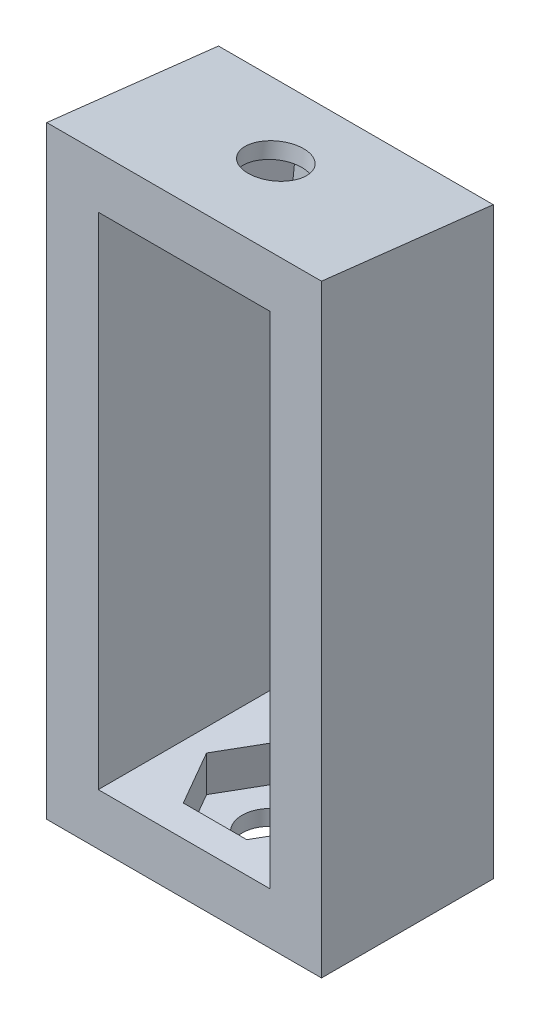
ISO-10303-21;
HEADER;
FILE_DESCRIPTION(('STEP AP214'),'2;1');
FILE_NAME('part.step','',(''),(''),'','','');
FILE_SCHEMA(('AUTOMOTIVE_DESIGN { 1 0 10303 214 1 1 1 1 }'));
ENDSEC;
DATA;
#1=APPLICATION_CONTEXT('core data for automotive mechanical design processes');
#2=APPLICATION_PROTOCOL_DEFINITION('international standard','automotive_design',2000,#1);
#3=PRODUCT_CONTEXT('',#1,'mechanical');
#4=PRODUCT('Part','Part','',(#3));
#5=PRODUCT_RELATED_PRODUCT_CATEGORY('part','',(#4));
#6=PRODUCT_DEFINITION_FORMATION('','',#4);
#7=PRODUCT_DEFINITION_CONTEXT('part definition',#1,'design');
#8=PRODUCT_DEFINITION('design','',#6,#7);
#9=PRODUCT_DEFINITION_SHAPE('','',#8);
#10=(LENGTH_UNIT() NAMED_UNIT(*) SI_UNIT(.MILLI.,.METRE.));
#11=(NAMED_UNIT(*) PLANE_ANGLE_UNIT() SI_UNIT($,.RADIAN.));
#12=(NAMED_UNIT(*) SI_UNIT($,.STERADIAN.) SOLID_ANGLE_UNIT());
#13=UNCERTAINTY_MEASURE_WITH_UNIT(LENGTH_MEASURE(1.E-05),#10,'distance_accuracy_value','');
#14=(GEOMETRIC_REPRESENTATION_CONTEXT(3) GLOBAL_UNCERTAINTY_ASSIGNED_CONTEXT((#13)) GLOBAL_UNIT_ASSIGNED_CONTEXT((#10,
#11,#12)) REPRESENTATION_CONTEXT('',''));
#15=CARTESIAN_POINT('',(0.,0.,0.));
#16=DIRECTION('',(0.,0.,1.));
#17=DIRECTION('',(1.,0.,0.));
#18=AXIS2_PLACEMENT_3D('',#15,#16,#17);
#19=CARTESIAN_POINT('',(3.,0.,10.));
#20=DIRECTION('',(0.,0.,1.));
#21=DIRECTION('',(1.,0.,0.));
#22=AXIS2_PLACEMENT_3D('',#19,#20,#21);
#23=PLANE('',#22);
#24=DIRECTION('',(0.,1.,0.));
#25=VECTOR('',#24,1.);
#26=CARTESIAN_POINT('',(3.,0.,10.));
#27=LINE('',#26,#25);
#28=CARTESIAN_POINT('',(3.,3.,10.));
#29=VERTEX_POINT('',#28);
#30=CARTESIAN_POINT('',(3.,32.1199468849196,10.));
#31=VERTEX_POINT('',#30);
#32=EDGE_CURVE('E402',#29,#31,#27,.T.);
#33=ORIENTED_EDGE('',*,*,#32,.T.);
#34=DIRECTION('',(1.,0.,0.));
#35=VECTOR('',#34,1.);
#36=CARTESIAN_POINT('',(-7.83029679479711,32.1199468849196,10.));
#37=LINE('',#36,#35);
#38=CARTESIAN_POINT('',(13.,32.1199468849196,10.));
#39=VERTEX_POINT('',#38);
#40=EDGE_CURVE('E351',#31,#39,#37,.T.);
#41=ORIENTED_EDGE('',*,*,#40,.T.);
#42=DIRECTION('',(0.,1.,0.));
#43=VECTOR('',#42,1.);
#44=CARTESIAN_POINT('',(13.,0.,10.));
#45=LINE('',#44,#43);
#46=CARTESIAN_POINT('',(13.,3.,10.));
#47=VERTEX_POINT('',#46);
#48=EDGE_CURVE('E377',#47,#39,#45,.T.);
#49=ORIENTED_EDGE('',*,*,#48,.F.);
#50=DIRECTION('',(1.,0.,0.));
#51=VECTOR('',#50,1.);
#52=CARTESIAN_POINT('',(-7.83029679479711,3.,10.));
#53=LINE('',#52,#51);
#54=EDGE_CURVE('E395',#29,#47,#53,.T.);
#55=ORIENTED_EDGE('',*,*,#54,.F.);
#56=EDGE_LOOP('',(#33,#41,#49,#55));
#57=FACE_BOUND('',#56,.T.);
#58=DIRECTION('',(0.,1.,0.));
#59=VECTOR('',#58,1.);
#60=CARTESIAN_POINT('',(0.,0.,10.));
#61=LINE('',#60,#59);
#62=CARTESIAN_POINT('',(0.,0.,10.));
#63=VERTEX_POINT('',#62);
#64=CARTESIAN_POINT('',(0.,35.1393560830164,10.));
#65=VERTEX_POINT('',#64);
#66=EDGE_CURVE('E390',#63,#65,#61,.T.);
#67=ORIENTED_EDGE('',*,*,#66,.F.);
#68=DIRECTION('',(-1.,0.,0.));
#69=VECTOR('',#68,1.);
#70=CARTESIAN_POINT('',(3.,0.,10.));
#71=LINE('',#70,#69);
#72=CARTESIAN_POINT('',(16.,0.,10.));
#73=VERTEX_POINT('',#72);
#74=EDGE_CURVE('E12',#73,#63,#71,.T.);
#75=ORIENTED_EDGE('',*,*,#74,.F.);
#76=DIRECTION('',(0.,1.,0.));
#77=VECTOR('',#76,1.);
#78=CARTESIAN_POINT('',(16.,0.,10.));
#79=LINE('',#78,#77);
#80=CARTESIAN_POINT('',(16.,35.1393560830164,10.));
#81=VERTEX_POINT('',#80);
#82=EDGE_CURVE('E363',#73,#81,#79,.T.);
#83=ORIENTED_EDGE('',*,*,#82,.T.);
#84=DIRECTION('',(-1.,0.,0.));
#85=VECTOR('',#84,1.);
#86=CARTESIAN_POINT('',(3.,35.1393560830164,10.));
#87=LINE('',#86,#85);
#88=EDGE_CURVE('E410',#81,#65,#87,.T.);
#89=ORIENTED_EDGE('',*,*,#88,.T.);
#90=EDGE_LOOP('',(#67,#75,#83,#89));
#91=FACE_BOUND('',#90,.T.);
#92=ADVANCED_FACE('F68',(#57,#91),#23,.T.);
#93=CARTESIAN_POINT('',(3.,0.,0.));
#94=DIRECTION('',(0.,-1.,0.));
#95=DIRECTION('',(0.,0.,-1.));
#96=AXIS2_PLACEMENT_3D('',#93,#94,#95);
#97=PLANE('',#96);
#98=CARTESIAN_POINT('',(8.,0.,5.));
#99=DIRECTION('',(0.,1.,0.));
#100=DIRECTION('',(0.,0.,1.));
#101=AXIS2_PLACEMENT_3D('',#98,#99,#100);
#102=CIRCLE('',#101,1.625);
#103=CARTESIAN_POINT('',(8.,0.,6.625));
#104=VERTEX_POINT('',#103);
#105=EDGE_CURVE('E796',#104,#104,#102,.T.);
#106=ORIENTED_EDGE('',*,*,#105,.T.);
#107=EDGE_LOOP('',(#106));
#108=FACE_BOUND('',#107,.T.);
#109=DIRECTION('',(0.,0.,1.));
#110=VECTOR('',#109,1.);
#111=CARTESIAN_POINT('',(0.,0.,0.));
#112=LINE('',#111,#110);
#113=CARTESIAN_POINT('',(0.,0.,0.));
#114=VERTEX_POINT('',#113);
#115=EDGE_CURVE('E414',#114,#63,#112,.T.);
#116=ORIENTED_EDGE('',*,*,#115,.F.);
#117=DIRECTION('',(-1.,0.,0.));
#118=VECTOR('',#117,1.);
#119=CARTESIAN_POINT('',(3.,0.,0.));
#120=LINE('',#119,#118);
#121=CARTESIAN_POINT('',(16.,0.,0.));
#122=VERTEX_POINT('',#121);
#123=EDGE_CURVE('E77',#122,#114,#120,.T.);
#124=ORIENTED_EDGE('',*,*,#123,.F.);
#125=DIRECTION('',(0.,0.,1.));
#126=VECTOR('',#125,1.);
#127=CARTESIAN_POINT('',(16.,0.,0.));
#128=LINE('',#127,#126);
#129=EDGE_CURVE('E362',#122,#73,#128,.T.);
#130=ORIENTED_EDGE('',*,*,#129,.T.);
#131=ORIENTED_EDGE('',*,*,#74,.T.);
#132=EDGE_LOOP('',(#116,#124,#130,#131));
#133=FACE_BOUND('',#132,.T.);
#134=ADVANCED_FACE('F441',(#108,#133),#97,.T.);
#135=CARTESIAN_POINT('',(3.,0.,0.));
#136=DIRECTION('',(0.,0.,1.));
#137=DIRECTION('',(1.,0.,0.));
#138=AXIS2_PLACEMENT_3D('',#135,#136,#137);
#139=PLANE('',#138);
#140=DIRECTION('',(1.,0.,0.));
#141=VECTOR('',#140,1.);
#142=CARTESIAN_POINT('',(-7.83029679479711,30.9805908019032,0.));
#143=LINE('',#142,#141);
#144=CARTESIAN_POINT('',(3.,30.9805908019032,0.));
#145=VERTEX_POINT('',#144);
#146=CARTESIAN_POINT('',(13.,30.9805908019032,0.));
#147=VERTEX_POINT('',#146);
#148=EDGE_CURVE('E352',#145,#147,#143,.T.);
#149=ORIENTED_EDGE('',*,*,#148,.F.);
#150=DIRECTION('',(0.,1.,0.));
#151=VECTOR('',#150,1.);
#152=CARTESIAN_POINT('',(3.,0.,0.));
#153=LINE('',#152,#151);
#154=CARTESIAN_POINT('',(3.,3.,0.));
#155=VERTEX_POINT('',#154);
#156=EDGE_CURVE('E406',#155,#145,#153,.T.);
#157=ORIENTED_EDGE('',*,*,#156,.F.);
#158=DIRECTION('',(1.,0.,0.));
#159=VECTOR('',#158,1.);
#160=CARTESIAN_POINT('',(-7.83029679479711,3.,0.));
#161=LINE('',#160,#159);
#162=CARTESIAN_POINT('',(13.,3.,0.));
#163=VERTEX_POINT('',#162);
#164=EDGE_CURVE('E391',#155,#163,#161,.T.);
#165=ORIENTED_EDGE('',*,*,#164,.T.);
#166=DIRECTION('',(0.,1.,0.));
#167=VECTOR('',#166,1.);
#168=CARTESIAN_POINT('',(13.,0.,0.));
#169=LINE('',#168,#167);
#170=EDGE_CURVE('E368',#163,#147,#169,.T.);
#171=ORIENTED_EDGE('',*,*,#170,.T.);
#172=EDGE_LOOP('',(#149,#157,#165,#171));
#173=FACE_BOUND('',#172,.T.);
#174=DIRECTION('',(0.,1.,0.));
#175=VECTOR('',#174,1.);
#176=CARTESIAN_POINT('',(0.,0.,0.));
#177=LINE('',#176,#175);
#178=CARTESIAN_POINT('',(0.,34.,0.));
#179=VERTEX_POINT('',#178);
#180=EDGE_CURVE('E418',#114,#179,#177,.T.);
#181=ORIENTED_EDGE('',*,*,#180,.T.);
#182=DIRECTION('',(-1.,0.,0.));
#183=VECTOR('',#182,1.);
#184=CARTESIAN_POINT('',(3.,34.,0.));
#185=LINE('',#184,#183);
#186=CARTESIAN_POINT('',(16.,34.,0.));
#187=VERTEX_POINT('',#186);
#188=EDGE_CURVE('E427',#187,#179,#185,.T.);
#189=ORIENTED_EDGE('',*,*,#188,.F.);
#190=DIRECTION('',(0.,1.,0.));
#191=VECTOR('',#190,1.);
#192=CARTESIAN_POINT('',(16.,0.,0.));
#193=LINE('',#192,#191);
#194=EDGE_CURVE('E367',#122,#187,#193,.T.);
#195=ORIENTED_EDGE('',*,*,#194,.F.);
#196=ORIENTED_EDGE('',*,*,#123,.T.);
#197=EDGE_LOOP('',(#181,#189,#195,#196));
#198=FACE_BOUND('',#197,.T.);
#199=ADVANCED_FACE('F434',(#173,#198),#139,.F.);
#200=CARTESIAN_POINT('',(3.,33.5642911013491,-3.82416792384546));
#201=DIRECTION('',(0.,0.993571855676588,-0.113203213767899));
#202=DIRECTION('',(0.,0.113203213767899,0.993571855676588));
#203=AXIS2_PLACEMENT_3D('',#200,#201,#202);
#204=PLANE('',#203);
#205=CARTESIAN_POINT('',(8.,34.5309844104412,4.66039035869631));
#206=DIRECTION('',(0.,0.993571855676588,-0.113203213767899));
#207=DIRECTION('',(0.,0.113203213767899,0.993571855676588));
#208=AXIS2_PLACEMENT_3D('',#205,#206,#207);
#209=CIRCLE('',#208,1.625);
#210=CARTESIAN_POINT('',(8.,34.714939632814,6.27494462417076));
#211=VERTEX_POINT('',#210);
#212=EDGE_CURVE('E280',#211,#211,#209,.T.);
#213=ORIENTED_EDGE('',*,*,#212,.F.);
#214=EDGE_LOOP('',(#213));
#215=FACE_BOUND('',#214,.T.);
#216=DIRECTION('',(0.,-0.113203213767899,-0.993571855676588));
#217=VECTOR('',#216,1.);
#218=CARTESIAN_POINT('',(0.,33.5642911013491,-3.82416792384546));
#219=LINE('',#218,#217);
#220=EDGE_CURVE('E407',#65,#179,#219,.T.);
#221=ORIENTED_EDGE('',*,*,#220,.F.);
#222=ORIENTED_EDGE('',*,*,#88,.F.);
#223=DIRECTION('',(0.,-0.113203213767899,-0.993571855676588));
#224=VECTOR('',#223,1.);
#225=CARTESIAN_POINT('',(16.,33.5642911013491,-3.82416792384546));
#226=LINE('',#225,#224);
#227=EDGE_CURVE('E372',#81,#187,#226,.T.);
#228=ORIENTED_EDGE('',*,*,#227,.T.);
#229=ORIENTED_EDGE('',*,*,#188,.T.);
#230=EDGE_LOOP('',(#221,#222,#228,#229));
#231=FACE_BOUND('',#230,.T.);
#232=ADVANCED_FACE('F446',(#215,#231),#204,.T.);
#233=CARTESIAN_POINT('',(3.,0.,0.));
#234=DIRECTION('',(1.,0.,0.));
#235=DIRECTION('',(0.,0.,-1.));
#236=AXIS2_PLACEMENT_3D('',#233,#234,#235);
#237=PLANE('',#236);
#238=DIRECTION('',(0.,0.1132032137679,0.993571855676588));
#239=VECTOR('',#238,1.);
#240=CARTESIAN_POINT('',(3.,30.5835755343193,-3.48455828254177));
#241=LINE('',#240,#239);
#242=EDGE_CURVE('E356',#145,#31,#241,.T.);
#243=ORIENTED_EDGE('',*,*,#242,.T.);
#244=ORIENTED_EDGE('',*,*,#32,.F.);
#245=DIRECTION('',(0.,0.,1.));
#246=VECTOR('',#245,1.);
#247=CARTESIAN_POINT('',(3.,3.,0.));
#248=LINE('',#247,#246);
#249=EDGE_CURVE('E386',#155,#29,#248,.T.);
#250=ORIENTED_EDGE('',*,*,#249,.F.);
#251=ORIENTED_EDGE('',*,*,#156,.T.);
#252=EDGE_LOOP('',(#243,#244,#250,#251));
#253=FACE_BOUND('',#252,.T.);
#254=ADVANCED_FACE('F482',(#253),#237,.T.);
#255=CARTESIAN_POINT('',(0.,0.,0.));
#256=DIRECTION('',(1.,0.,0.));
#257=DIRECTION('',(0.,0.,-1.));
#258=AXIS2_PLACEMENT_3D('',#255,#256,#257);
#259=PLANE('',#258);
#260=ORIENTED_EDGE('',*,*,#66,.T.);
#261=ORIENTED_EDGE('',*,*,#220,.T.);
#262=ORIENTED_EDGE('',*,*,#180,.F.);
#263=ORIENTED_EDGE('',*,*,#115,.T.);
#264=EDGE_LOOP('',(#260,#261,#262,#263));
#265=FACE_BOUND('',#264,.T.);
#266=ADVANCED_FACE('F439',(#265),#259,.F.);
#267=CARTESIAN_POINT('',(-7.83029679479711,3.,0.));
#268=DIRECTION('',(0.,-1.,0.));
#269=DIRECTION('',(0.,0.,-1.));
#270=AXIS2_PLACEMENT_3D('',#267,#268,#269);
#271=PLANE('',#270);
#272=DIRECTION('',(-0.5,0.,0.866025403784439));
#273=VECTOR('',#272,1.);
#274=CARTESIAN_POINT('',(6.1524791385932,3.,1.8));
#275=LINE('',#274,#273);
#276=CARTESIAN_POINT('',(6.1524791385932,3.,1.8));
#277=VERTEX_POINT('',#276);
#278=CARTESIAN_POINT('',(4.3049582771864,3.,5.));
#279=VERTEX_POINT('',#278);
#280=EDGE_CURVE('E252',#277,#279,#275,.T.);
#281=ORIENTED_EDGE('',*,*,#280,.F.);
#282=DIRECTION('',(-1.,0.,0.));
#283=VECTOR('',#282,1.);
#284=CARTESIAN_POINT('',(9.8475208614068,3.,1.8));
#285=LINE('',#284,#283);
#286=CARTESIAN_POINT('',(9.8475208614068,3.,1.8));
#287=VERTEX_POINT('',#286);
#288=EDGE_CURVE('E84',#287,#277,#285,.T.);
#289=ORIENTED_EDGE('',*,*,#288,.F.);
#290=DIRECTION('',(-0.500000000000001,0.,-0.866025403784438));
#291=VECTOR('',#290,1.);
#292=CARTESIAN_POINT('',(11.6950417228136,3.,5.));
#293=LINE('',#292,#291);
#294=CARTESIAN_POINT('',(11.6950417228136,3.,5.));
#295=VERTEX_POINT('',#294);
#296=EDGE_CURVE('E229',#295,#287,#293,.T.);
#297=ORIENTED_EDGE('',*,*,#296,.F.);
#298=DIRECTION('',(0.5,0.,-0.866025403784439));
#299=VECTOR('',#298,1.);
#300=CARTESIAN_POINT('',(9.8475208614068,3.,8.2));
#301=LINE('',#300,#299);
#302=CARTESIAN_POINT('',(9.8475208614068,3.,8.2));
#303=VERTEX_POINT('',#302);
#304=EDGE_CURVE('E233',#303,#295,#301,.T.);
#305=ORIENTED_EDGE('',*,*,#304,.F.);
#306=DIRECTION('',(1.,0.,0.));
#307=VECTOR('',#306,1.);
#308=CARTESIAN_POINT('',(6.1524791385932,3.,8.2));
#309=LINE('',#308,#307);
#310=CARTESIAN_POINT('',(6.1524791385932,3.,8.2));
#311=VERTEX_POINT('',#310);
#312=EDGE_CURVE('E259',#311,#303,#309,.T.);
#313=ORIENTED_EDGE('',*,*,#312,.F.);
#314=DIRECTION('',(0.5,0.,0.866025403784438));
#315=VECTOR('',#314,1.);
#316=CARTESIAN_POINT('',(4.3049582771864,3.,5.));
#317=LINE('',#316,#315);
#318=EDGE_CURVE('E255',#279,#311,#317,.T.);
#319=ORIENTED_EDGE('',*,*,#318,.F.);
#320=EDGE_LOOP('',(#281,#289,#297,#305,#313,#319));
#321=FACE_BOUND('',#320,.T.);
#322=ORIENTED_EDGE('',*,*,#164,.F.);
#323=ORIENTED_EDGE('',*,*,#249,.T.);
#324=ORIENTED_EDGE('',*,*,#54,.T.);
#325=DIRECTION('',(0.,0.,-1.));
#326=VECTOR('',#325,1.);
#327=CARTESIAN_POINT('',(13.,3.,0.));
#328=LINE('',#327,#326);
#329=EDGE_CURVE('E376',#47,#163,#328,.T.);
#330=ORIENTED_EDGE('',*,*,#329,.T.);
#331=EDGE_LOOP('',(#322,#323,#324,#330));
#332=FACE_BOUND('',#331,.T.);
#333=ADVANCED_FACE('F461',(#321,#332),#271,.F.);
#334=CARTESIAN_POINT('',(13.,0.,0.));
#335=DIRECTION('',(1.,0.,0.));
#336=DIRECTION('',(0.,0.,-1.));
#337=AXIS2_PLACEMENT_3D('',#334,#335,#336);
#338=PLANE('',#337);
#339=ORIENTED_EDGE('',*,*,#48,.T.);
#340=DIRECTION('',(0.,-0.1132032137679,-0.993571855676588));
#341=VECTOR('',#340,1.);
#342=CARTESIAN_POINT('',(13.,30.5835755343193,-3.48455828254177));
#343=LINE('',#342,#341);
#344=EDGE_CURVE('E334',#39,#147,#343,.T.);
#345=ORIENTED_EDGE('',*,*,#344,.T.);
#346=ORIENTED_EDGE('',*,*,#170,.F.);
#347=ORIENTED_EDGE('',*,*,#329,.F.);
#348=EDGE_LOOP('',(#339,#345,#346,#347));
#349=FACE_BOUND('',#348,.T.);
#350=ADVANCED_FACE('F452',(#349),#338,.F.);
#351=CARTESIAN_POINT('',(16.,0.,0.));
#352=DIRECTION('',(1.,0.,0.));
#353=DIRECTION('',(0.,0.,-1.));
#354=AXIS2_PLACEMENT_3D('',#351,#352,#353);
#355=PLANE('',#354);
#356=ORIENTED_EDGE('',*,*,#82,.F.);
#357=ORIENTED_EDGE('',*,*,#129,.F.);
#358=ORIENTED_EDGE('',*,*,#194,.T.);
#359=ORIENTED_EDGE('',*,*,#227,.F.);
#360=EDGE_LOOP('',(#356,#357,#358,#359));
#361=FACE_BOUND('',#360,.T.);
#362=ADVANCED_FACE('F449',(#361),#355,.T.);
#363=CARTESIAN_POINT('',(-7.83029679479711,30.5835755343193,-3.48455828254177));
#364=DIRECTION('',(0.,-0.993571855676588,0.1132032137679));
#365=DIRECTION('',(0.,-0.1132032137679,-0.993571855676588));
#366=AXIS2_PLACEMENT_3D('',#363,#364,#365);
#367=PLANE('',#366);
#368=DIRECTION('',(0.5,-0.0980368589130412,-0.860458467501171));
#369=VECTOR('',#368,1.);
#370=CARTESIAN_POINT('',(6.92640950427774,31.0362711552159,0.488700189015822));
#371=LINE('',#370,#369);
#372=CARTESIAN_POINT('',(4.30495827718639,31.5502688434114,5.));
#373=VERTEX_POINT('',#372);
#374=CARTESIAN_POINT('',(6.15247913859319,31.1880185593541,1.82057006183492));
#375=VERTEX_POINT('',#374);
#376=EDGE_CURVE('E92',#373,#375,#371,.T.);
#377=ORIENTED_EDGE('',*,*,#376,.F.);
#378=DIRECTION('',(-0.5,-0.0980368589130414,-0.860458467501172));
#379=VECTOR('',#378,1.);
#380=CARTESIAN_POINT('',(-0.468972088498158,30.6142265679688,-3.21553761282847));
#381=LINE('',#380,#379);
#382=CARTESIAN_POINT('',(6.15247913859319,31.9125191274687,8.17942993816509));
#383=VERTEX_POINT('',#382);
#384=EDGE_CURVE('E289',#383,#373,#381,.T.);
#385=ORIENTED_EDGE('',*,*,#384,.F.);
#386=DIRECTION('',(-1.,0.,0.));
#387=VECTOR('',#386,1.);
#388=CARTESIAN_POINT('',(0.,31.9125191274687,8.17942993816509));
#389=LINE('',#388,#387);
#390=CARTESIAN_POINT('',(9.8475208614068,31.9125191274687,8.17942993816508));
#391=VERTEX_POINT('',#390);
#392=EDGE_CURVE('E324',#391,#383,#389,.T.);
#393=ORIENTED_EDGE('',*,*,#392,.F.);
#394=DIRECTION('',(-0.5,0.0980368589130412,0.860458467501171));
#395=VECTOR('',#394,1.);
#396=CARTESIAN_POINT('',(12.4689720884982,31.3985214392731,3.6681301271809));
#397=LINE('',#396,#395);
#398=CARTESIAN_POINT('',(11.6950417228136,31.5502688434114,5.));
#399=VERTEX_POINT('',#398);
#400=EDGE_CURVE('E320',#399,#391,#397,.T.);
#401=ORIENTED_EDGE('',*,*,#400,.F.);
#402=DIRECTION('',(0.5,0.0980368589130413,0.860458467501171));
#403=VECTOR('',#402,1.);
#404=CARTESIAN_POINT('',(5.07359049572225,30.2519762839115,-6.39496755099355));
#405=LINE('',#404,#403);
#406=CARTESIAN_POINT('',(9.8475208614068,31.1880185593541,1.82057006183492));
#407=VERTEX_POINT('',#406);
#408=EDGE_CURVE('E316',#407,#399,#405,.T.);
#409=ORIENTED_EDGE('',*,*,#408,.F.);
#410=DIRECTION('',(1.,0.,0.));
#411=VECTOR('',#410,1.);
#412=CARTESIAN_POINT('',(0.,31.1880185593541,1.82057006183492));
#413=LINE('',#412,#411);
#414=EDGE_CURVE('E312',#375,#407,#413,.T.);
#415=ORIENTED_EDGE('',*,*,#414,.F.);
#416=EDGE_LOOP('',(#377,#385,#393,#401,#409,#415));
#417=FACE_BOUND('',#416,.T.);
#418=ORIENTED_EDGE('',*,*,#242,.F.);
#419=ORIENTED_EDGE('',*,*,#148,.T.);
#420=ORIENTED_EDGE('',*,*,#344,.F.);
#421=ORIENTED_EDGE('',*,*,#40,.F.);
#422=EDGE_LOOP('',(#418,#419,#420,#421));
#423=FACE_BOUND('',#422,.T.);
#424=ADVANCED_FACE('F451',(#417,#423),#367,.T.);
#425=CARTESIAN_POINT('',(6.92640950427774,33.1227720521367,0.250973440103233));
#426=DIRECTION('',(-0.866025403784439,-0.0566016068839497,-0.496785927838294));
#427=DIRECTION('',(-0.497583632026221,0.,0.867416006965282));
#428=AXIS2_PLACEMENT_3D('',#425,#426,#427);
#429=PLANE('',#428);
#430=ORIENTED_EDGE('',*,*,#376,.T.);
#431=DIRECTION('',(0.,-0.993571855676588,0.113203213767899));
#432=VECTOR('',#431,1.);
#433=CARTESIAN_POINT('',(6.15247913859319,33.274519456275,1.58284331292233));
#434=LINE('',#433,#432);
#435=CARTESIAN_POINT('',(6.15247913859319,33.274519456275,1.58284331292233));
#436=VERTEX_POINT('',#435);
#437=EDGE_CURVE('E309',#436,#375,#434,.T.);
#438=ORIENTED_EDGE('',*,*,#437,.F.);
#439=DIRECTION('',(0.5,-0.0980368589130412,-0.860458467501171));
#440=VECTOR('',#439,1.);
#441=CARTESIAN_POINT('',(6.92640950427774,33.1227720521367,0.250973440103233));
#442=LINE('',#441,#440);
#443=CARTESIAN_POINT('',(4.30495827718639,33.6367697403322,4.76227325108741));
#444=VERTEX_POINT('',#443);
#445=EDGE_CURVE('E284',#444,#436,#442,.T.);
#446=ORIENTED_EDGE('',*,*,#445,.F.);
#447=DIRECTION('',(0.,-0.993571855676588,0.113203213767899));
#448=VECTOR('',#447,1.);
#449=CARTESIAN_POINT('',(4.30495827718639,33.6367697403322,4.76227325108741));
#450=LINE('',#449,#448);
#451=EDGE_CURVE('E331',#444,#373,#450,.T.);
#452=ORIENTED_EDGE('',*,*,#451,.T.);
#453=EDGE_LOOP('',(#430,#438,#446,#452));
#454=FACE_BOUND('',#453,.T.);
#455=ADVANCED_FACE('F458',(#454),#429,.F.);
#456=CARTESIAN_POINT('',(-0.468972088498158,32.7007274648896,-3.45326436174106));
#457=DIRECTION('',(-0.866025403784439,0.0566016068839496,0.496785927838294));
#458=DIRECTION('',(0.497583632026221,0.,0.867416006965282));
#459=AXIS2_PLACEMENT_3D('',#456,#457,#458);
#460=PLANE('',#459);
#461=ORIENTED_EDGE('',*,*,#384,.T.);
#462=ORIENTED_EDGE('',*,*,#451,.F.);
#463=DIRECTION('',(-0.5,-0.0980368589130414,-0.860458467501172));
#464=VECTOR('',#463,1.);
#465=CARTESIAN_POINT('',(-0.468972088498158,32.7007274648896,-3.45326436174106));
#466=LINE('',#465,#464);
#467=CARTESIAN_POINT('',(6.15247913859319,33.9990200243895,7.9417031892525));
#468=VERTEX_POINT('',#467);
#469=EDGE_CURVE('E305',#468,#444,#466,.T.);
#470=ORIENTED_EDGE('',*,*,#469,.F.);
#471=DIRECTION('',(0.,-0.993571855676588,0.113203213767899));
#472=VECTOR('',#471,1.);
#473=CARTESIAN_POINT('',(6.15247913859319,33.9990200243895,7.9417031892525));
#474=LINE('',#473,#472);
#475=EDGE_CURVE('E335',#468,#383,#474,.T.);
#476=ORIENTED_EDGE('',*,*,#475,.T.);
#477=EDGE_LOOP('',(#461,#462,#470,#476));
#478=FACE_BOUND('',#477,.T.);
#479=ADVANCED_FACE('F628',(#478),#460,.F.);
#480=CARTESIAN_POINT('',(0.,33.9990200243895,7.9417031892525));
#481=DIRECTION('',(0.,0.113203213767899,0.993571855676588));
#482=DIRECTION('',(0.,-0.993571855676588,0.113203213767899));
#483=AXIS2_PLACEMENT_3D('',#480,#481,#482);
#484=PLANE('',#483);
#485=ORIENTED_EDGE('',*,*,#392,.T.);
#486=ORIENTED_EDGE('',*,*,#475,.F.);
#487=DIRECTION('',(-1.,0.,0.));
#488=VECTOR('',#487,1.);
#489=CARTESIAN_POINT('',(0.,33.9990200243895,7.9417031892525));
#490=LINE('',#489,#488);
#491=CARTESIAN_POINT('',(9.8475208614068,33.9990200243895,7.94170318925249));
#492=VERTEX_POINT('',#491);
#493=EDGE_CURVE('E301',#492,#468,#490,.T.);
#494=ORIENTED_EDGE('',*,*,#493,.F.);
#495=DIRECTION('',(0.,-0.993571855676588,0.113203213767899));
#496=VECTOR('',#495,1.);
#497=CARTESIAN_POINT('',(9.8475208614068,33.9990200243895,7.94170318925249));
#498=LINE('',#497,#496);
#499=EDGE_CURVE('E338',#492,#391,#498,.T.);
#500=ORIENTED_EDGE('',*,*,#499,.T.);
#501=EDGE_LOOP('',(#485,#486,#494,#500));
#502=FACE_BOUND('',#501,.T.);
#503=ADVANCED_FACE('F631',(#502),#484,.F.);
#504=CARTESIAN_POINT('',(12.4689720884982,33.485022336194,3.43040337826831));
#505=DIRECTION('',(0.866025403784439,0.0566016068839497,0.496785927838294));
#506=DIRECTION('',(0.497583632026221,0.,-0.867416006965282));
#507=AXIS2_PLACEMENT_3D('',#504,#505,#506);
#508=PLANE('',#507);
#509=ORIENTED_EDGE('',*,*,#400,.T.);
#510=ORIENTED_EDGE('',*,*,#499,.F.);
#511=DIRECTION('',(-0.5,0.0980368589130412,0.860458467501171));
#512=VECTOR('',#511,1.);
#513=CARTESIAN_POINT('',(12.4689720884982,33.485022336194,3.43040337826831));
#514=LINE('',#513,#512);
#515=CARTESIAN_POINT('',(11.6950417228136,33.6367697403322,4.76227325108742));
#516=VERTEX_POINT('',#515);
#517=EDGE_CURVE('E297',#516,#492,#514,.T.);
#518=ORIENTED_EDGE('',*,*,#517,.F.);
#519=DIRECTION('',(0.,-0.993571855676588,0.113203213767899));
#520=VECTOR('',#519,1.);
#521=CARTESIAN_POINT('',(11.6950417228136,33.6367697403322,4.76227325108742));
#522=LINE('',#521,#520);
#523=EDGE_CURVE('E341',#516,#399,#522,.T.);
#524=ORIENTED_EDGE('',*,*,#523,.T.);
#525=EDGE_LOOP('',(#509,#510,#518,#524));
#526=FACE_BOUND('',#525,.T.);
#527=ADVANCED_FACE('F635',(#526),#508,.F.);
#528=CARTESIAN_POINT('',(5.07359049572225,32.3384771808324,-6.63269429990614));
#529=DIRECTION('',(0.866025403784439,-0.0566016068839497,-0.496785927838294));
#530=DIRECTION('',(-0.497583632026221,0.,-0.867416006965282));
#531=AXIS2_PLACEMENT_3D('',#528,#529,#530);
#532=PLANE('',#531);
#533=ORIENTED_EDGE('',*,*,#408,.T.);
#534=ORIENTED_EDGE('',*,*,#523,.F.);
#535=DIRECTION('',(0.5,0.0980368589130413,0.860458467501171));
#536=VECTOR('',#535,1.);
#537=CARTESIAN_POINT('',(5.07359049572225,32.3384771808324,-6.63269429990614));
#538=LINE('',#537,#536);
#539=CARTESIAN_POINT('',(9.8475208614068,33.274519456275,1.58284331292233));
#540=VERTEX_POINT('',#539);
#541=EDGE_CURVE('E293',#540,#516,#538,.T.);
#542=ORIENTED_EDGE('',*,*,#541,.F.);
#543=DIRECTION('',(0.,-0.993571855676588,0.113203213767899));
#544=VECTOR('',#543,1.);
#545=CARTESIAN_POINT('',(9.8475208614068,33.274519456275,1.58284331292233));
#546=LINE('',#545,#544);
#547=EDGE_CURVE('E344',#540,#407,#546,.T.);
#548=ORIENTED_EDGE('',*,*,#547,.T.);
#549=EDGE_LOOP('',(#533,#534,#542,#548));
#550=FACE_BOUND('',#549,.T.);
#551=ADVANCED_FACE('F639',(#550),#532,.F.);
#552=CARTESIAN_POINT('',(0.,33.274519456275,1.58284331292233));
#553=DIRECTION('',(0.,-0.113203213767899,-0.993571855676588));
#554=DIRECTION('',(0.,0.993571855676588,-0.113203213767899));
#555=AXIS2_PLACEMENT_3D('',#552,#553,#554);
#556=PLANE('',#555);
#557=ORIENTED_EDGE('',*,*,#414,.T.);
#558=ORIENTED_EDGE('',*,*,#547,.F.);
#559=DIRECTION('',(1.,0.,0.));
#560=VECTOR('',#559,1.);
#561=CARTESIAN_POINT('',(0.,33.274519456275,1.58284331292233));
#562=LINE('',#561,#560);
#563=EDGE_CURVE('E288',#436,#540,#562,.T.);
#564=ORIENTED_EDGE('',*,*,#563,.F.);
#565=ORIENTED_EDGE('',*,*,#437,.T.);
#566=EDGE_LOOP('',(#557,#558,#564,#565));
#567=FACE_BOUND('',#566,.T.);
#568=ADVANCED_FACE('F511',(#567),#556,.F.);
#569=CARTESIAN_POINT('',(0.,32.6700764312401,-3.72228503145435));
#570=DIRECTION('',(0.,-0.993571855676588,0.113203213767899));
#571=DIRECTION('',(0.,-0.113203213767899,-0.993571855676588));
#572=AXIS2_PLACEMENT_3D('',#569,#570,#571);
#573=PLANE('',#572);
#574=CARTESIAN_POINT('',(8.,33.6367697403322,4.76227325108741));
#575=DIRECTION('',(0.,-0.993571855676588,0.113203213767899));
#576=DIRECTION('',(0.,-0.113203213767899,-0.993571855676588));
#577=AXIS2_PLACEMENT_3D('',#574,#575,#576);
#578=CIRCLE('',#577,1.625);
#579=CARTESIAN_POINT('',(8.,33.4528145179594,3.14771898561296));
#580=VERTEX_POINT('',#579);
#581=EDGE_CURVE('E71',#580,#580,#578,.T.);
#582=ORIENTED_EDGE('',*,*,#581,.F.);
#583=EDGE_LOOP('',(#582));
#584=FACE_BOUND('',#583,.T.);
#585=ORIENTED_EDGE('',*,*,#445,.T.);
#586=ORIENTED_EDGE('',*,*,#563,.T.);
#587=ORIENTED_EDGE('',*,*,#541,.T.);
#588=ORIENTED_EDGE('',*,*,#517,.T.);
#589=ORIENTED_EDGE('',*,*,#493,.T.);
#590=ORIENTED_EDGE('',*,*,#469,.T.);
#591=EDGE_LOOP('',(#585,#586,#587,#588,#589,#590));
#592=FACE_BOUND('',#591,.T.);
#593=ADVANCED_FACE('F516',(#584,#592),#573,.T.);
#594=CARTESIAN_POINT('',(8.,35.6557396821604,4.5322406826225));
#595=DIRECTION('',(0.,-0.993571855676588,0.113203213767899));
#596=DIRECTION('',(0.,-0.113203213767899,-0.993571855676588));
#597=AXIS2_PLACEMENT_3D('',#594,#595,#596);
#598=CYLINDRICAL_SURFACE('',#597,1.625);
#599=ORIENTED_EDGE('',*,*,#212,.T.);
#600=EDGE_LOOP('',(#599));
#601=FACE_BOUND('',#600,.T.);
#602=ORIENTED_EDGE('',*,*,#581,.T.);
#603=EDGE_LOOP('',(#602));
#604=FACE_BOUND('',#603,.T.);
#605=ADVANCED_FACE('F521',(#601,#604),#598,.F.);
#606=CARTESIAN_POINT('',(9.8475208614068,0.9,1.8));
#607=DIRECTION('',(0.,0.,-1.));
#608=DIRECTION('',(0.,1.,0.));
#609=AXIS2_PLACEMENT_3D('',#606,#607,#608);
#610=PLANE('',#609);
#611=ORIENTED_EDGE('',*,*,#288,.T.);
#612=DIRECTION('',(0.,1.,0.));
#613=VECTOR('',#612,1.);
#614=CARTESIAN_POINT('',(6.1524791385932,0.9,1.8));
#615=LINE('',#614,#613);
#616=CARTESIAN_POINT('',(6.1524791385932,0.9,1.8));
#617=VERTEX_POINT('',#616);
#618=EDGE_CURVE('E203',#617,#277,#615,.T.);
#619=ORIENTED_EDGE('',*,*,#618,.F.);
#620=DIRECTION('',(-1.,0.,0.));
#621=VECTOR('',#620,1.);
#622=CARTESIAN_POINT('',(9.8475208614068,0.9,1.8));
#623=LINE('',#622,#621);
#624=CARTESIAN_POINT('',(9.8475208614068,0.9,1.8));
#625=VERTEX_POINT('',#624);
#626=EDGE_CURVE('E207',#625,#617,#623,.T.);
#627=ORIENTED_EDGE('',*,*,#626,.F.);
#628=DIRECTION('',(0.,1.,0.));
#629=VECTOR('',#628,1.);
#630=CARTESIAN_POINT('',(9.8475208614068,0.9,1.8));
#631=LINE('',#630,#629);
#632=EDGE_CURVE('E266',#625,#287,#631,.T.);
#633=ORIENTED_EDGE('',*,*,#632,.T.);
#634=EDGE_LOOP('',(#611,#619,#627,#633));
#635=FACE_BOUND('',#634,.T.);
#636=ADVANCED_FACE('F205',(#635),#610,.F.);
#637=CARTESIAN_POINT('',(11.6950417228136,0.899999999999999,5.));
#638=DIRECTION('',(0.866025403784438,0.,-0.500000000000001));
#639=DIRECTION('',(-0.500000000000001,0.,-0.866025403784438));
#640=AXIS2_PLACEMENT_3D('',#637,#638,#639);
#641=PLANE('',#640);
#642=ORIENTED_EDGE('',*,*,#296,.T.);
#643=ORIENTED_EDGE('',*,*,#632,.F.);
#644=DIRECTION('',(-0.500000000000001,0.,-0.866025403784438));
#645=VECTOR('',#644,1.);
#646=CARTESIAN_POINT('',(11.6950417228136,0.899999999999999,5.));
#647=LINE('',#646,#645);
#648=CARTESIAN_POINT('',(11.6950417228136,0.899999999999999,5.));
#649=VERTEX_POINT('',#648);
#650=EDGE_CURVE('E214',#649,#625,#647,.T.);
#651=ORIENTED_EDGE('',*,*,#650,.F.);
#652=DIRECTION('',(0.,1.,0.));
#653=VECTOR('',#652,1.);
#654=CARTESIAN_POINT('',(11.6950417228136,0.899999999999999,5.));
#655=LINE('',#654,#653);
#656=EDGE_CURVE('E269',#649,#295,#655,.T.);
#657=ORIENTED_EDGE('',*,*,#656,.T.);
#658=EDGE_LOOP('',(#642,#643,#651,#657));
#659=FACE_BOUND('',#658,.T.);
#660=ADVANCED_FACE('F548',(#659),#641,.F.);
#661=CARTESIAN_POINT('',(9.8475208614068,0.899999999999998,8.2));
#662=DIRECTION('',(0.866025403784439,0.,0.5));
#663=DIRECTION('',(0.5,0.,-0.866025403784439));
#664=AXIS2_PLACEMENT_3D('',#661,#662,#663);
#665=PLANE('',#664);
#666=ORIENTED_EDGE('',*,*,#304,.T.);
#667=ORIENTED_EDGE('',*,*,#656,.F.);
#668=DIRECTION('',(0.5,0.,-0.866025403784439));
#669=VECTOR('',#668,1.);
#670=CARTESIAN_POINT('',(9.8475208614068,0.899999999999998,8.2));
#671=LINE('',#670,#669);
#672=CARTESIAN_POINT('',(9.8475208614068,0.899999999999998,8.2));
#673=VERTEX_POINT('',#672);
#674=EDGE_CURVE('E245',#673,#649,#671,.T.);
#675=ORIENTED_EDGE('',*,*,#674,.F.);
#676=DIRECTION('',(0.,1.,0.));
#677=VECTOR('',#676,1.);
#678=CARTESIAN_POINT('',(9.8475208614068,0.899999999999998,8.2));
#679=LINE('',#678,#677);
#680=EDGE_CURVE('E272',#673,#303,#679,.T.);
#681=ORIENTED_EDGE('',*,*,#680,.T.);
#682=EDGE_LOOP('',(#666,#667,#675,#681));
#683=FACE_BOUND('',#682,.T.);
#684=ADVANCED_FACE('F557',(#683),#665,.F.);
#685=CARTESIAN_POINT('',(6.1524791385932,0.899999999999998,8.2));
#686=DIRECTION('',(0.,0.,1.));
#687=DIRECTION('',(0.,-1.,0.));
#688=AXIS2_PLACEMENT_3D('',#685,#686,#687);
#689=PLANE('',#688);
#690=ORIENTED_EDGE('',*,*,#312,.T.);
#691=ORIENTED_EDGE('',*,*,#680,.F.);
#692=DIRECTION('',(1.,0.,0.));
#693=VECTOR('',#692,1.);
#694=CARTESIAN_POINT('',(6.1524791385932,0.899999999999998,8.2));
#695=LINE('',#694,#693);
#696=CARTESIAN_POINT('',(6.1524791385932,0.899999999999998,8.2));
#697=VERTEX_POINT('',#696);
#698=EDGE_CURVE('E241',#697,#673,#695,.T.);
#699=ORIENTED_EDGE('',*,*,#698,.F.);
#700=DIRECTION('',(0.,1.,0.));
#701=VECTOR('',#700,1.);
#702=CARTESIAN_POINT('',(6.1524791385932,0.899999999999998,8.2));
#703=LINE('',#702,#701);
#704=EDGE_CURVE('E275',#697,#311,#703,.T.);
#705=ORIENTED_EDGE('',*,*,#704,.T.);
#706=EDGE_LOOP('',(#690,#691,#699,#705));
#707=FACE_BOUND('',#706,.T.);
#708=ADVANCED_FACE('F567',(#707),#689,.F.);
#709=CARTESIAN_POINT('',(4.3049582771864,0.899999999999999,5.));
#710=DIRECTION('',(-0.866025403784438,0.,0.5));
#711=DIRECTION('',(0.5,0.,0.866025403784439));
#712=AXIS2_PLACEMENT_3D('',#709,#710,#711);
#713=PLANE('',#712);
#714=ORIENTED_EDGE('',*,*,#318,.T.);
#715=ORIENTED_EDGE('',*,*,#704,.F.);
#716=DIRECTION('',(0.5,0.,0.866025403784438));
#717=VECTOR('',#716,1.);
#718=CARTESIAN_POINT('',(4.3049582771864,0.899999999999999,5.));
#719=LINE('',#718,#717);
#720=CARTESIAN_POINT('',(4.3049582771864,0.899999999999999,5.));
#721=VERTEX_POINT('',#720);
#722=EDGE_CURVE('E223',#721,#697,#719,.T.);
#723=ORIENTED_EDGE('',*,*,#722,.F.);
#724=DIRECTION('',(0.,1.,0.));
#725=VECTOR('',#724,1.);
#726=CARTESIAN_POINT('',(4.3049582771864,0.899999999999999,5.));
#727=LINE('',#726,#725);
#728=EDGE_CURVE('E213',#721,#279,#727,.T.);
#729=ORIENTED_EDGE('',*,*,#728,.T.);
#730=EDGE_LOOP('',(#714,#715,#723,#729));
#731=FACE_BOUND('',#730,.T.);
#732=ADVANCED_FACE('F577',(#731),#713,.F.);
#733=CARTESIAN_POINT('',(6.1524791385932,0.9,1.8));
#734=DIRECTION('',(-0.866025403784439,0.,-0.5));
#735=DIRECTION('',(-0.5,0.,0.866025403784439));
#736=AXIS2_PLACEMENT_3D('',#733,#734,#735);
#737=PLANE('',#736);
#738=ORIENTED_EDGE('',*,*,#280,.T.);
#739=ORIENTED_EDGE('',*,*,#728,.F.);
#740=DIRECTION('',(-0.5,0.,0.866025403784439));
#741=VECTOR('',#740,1.);
#742=CARTESIAN_POINT('',(6.1524791385932,0.9,1.8));
#743=LINE('',#742,#741);
#744=EDGE_CURVE('E217',#617,#721,#743,.T.);
#745=ORIENTED_EDGE('',*,*,#744,.F.);
#746=ORIENTED_EDGE('',*,*,#618,.T.);
#747=EDGE_LOOP('',(#738,#739,#745,#746));
#748=FACE_BOUND('',#747,.T.);
#749=ADVANCED_FACE('F218',(#748),#737,.F.);
#750=CARTESIAN_POINT('',(0.,0.900000000000001,0.));
#751=DIRECTION('',(0.,1.,0.));
#752=DIRECTION('',(0.,0.,1.));
#753=AXIS2_PLACEMENT_3D('',#750,#751,#752);
#754=PLANE('',#753);
#755=CARTESIAN_POINT('',(8.,0.899999999999999,5.));
#756=DIRECTION('',(0.,1.,0.));
#757=DIRECTION('',(0.,0.,1.));
#758=AXIS2_PLACEMENT_3D('',#755,#756,#757);
#759=CIRCLE('',#758,1.625);
#760=CARTESIAN_POINT('',(8.,0.899999999999999,6.625));
#761=VERTEX_POINT('',#760);
#762=EDGE_CURVE('E236',#761,#761,#759,.T.);
#763=ORIENTED_EDGE('',*,*,#762,.F.);
#764=EDGE_LOOP('',(#763));
#765=FACE_BOUND('',#764,.T.);
#766=ORIENTED_EDGE('',*,*,#626,.T.);
#767=ORIENTED_EDGE('',*,*,#744,.T.);
#768=ORIENTED_EDGE('',*,*,#722,.T.);
#769=ORIENTED_EDGE('',*,*,#698,.T.);
#770=ORIENTED_EDGE('',*,*,#674,.T.);
#771=ORIENTED_EDGE('',*,*,#650,.T.);
#772=EDGE_LOOP('',(#766,#767,#768,#769,#770,#771));
#773=FACE_BOUND('',#772,.T.);
#774=ADVANCED_FACE('F225',(#765,#773),#754,.T.);
#775=CARTESIAN_POINT('',(8.,0.,5.));
#776=DIRECTION('',(0.,1.,0.));
#777=DIRECTION('',(0.,0.,1.));
#778=AXIS2_PLACEMENT_3D('',#775,#776,#777);
#779=CYLINDRICAL_SURFACE('',#778,1.625);
#780=ORIENTED_EDGE('',*,*,#762,.T.);
#781=EDGE_LOOP('',(#780));
#782=FACE_BOUND('',#781,.T.);
#783=ORIENTED_EDGE('',*,*,#105,.F.);
#784=EDGE_LOOP('',(#783));
#785=FACE_BOUND('',#784,.T.);
#786=ADVANCED_FACE('F603',(#782,#785),#779,.F.);
#787=CLOSED_SHELL('',(#92,#134,#199,#232,#254,#266,#333,#350,#362,#424,#455,#479,#503,#527,#551,
#568,#593,#605,#636,#660,#684,#708,#732,#749,#774,#786));
#788=MANIFOLD_SOLID_BREP('B2',#787);
#789=ADVANCED_BREP_SHAPE_REPRESENTATION('',(#18,#788),#14);
#790=SHAPE_DEFINITION_REPRESENTATION(#9,#789);
ENDSEC;
END-ISO-10303-21;
